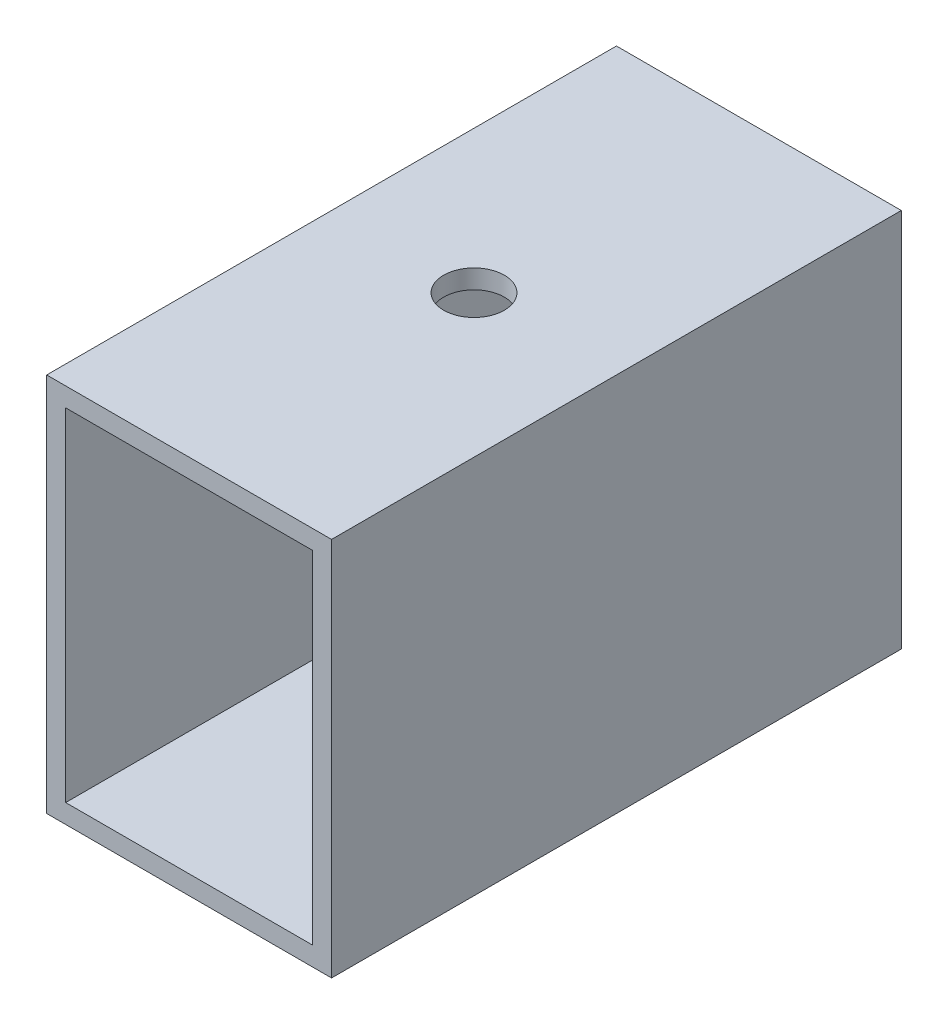
ISO-10303-21;
HEADER;
FILE_DESCRIPTION(('STEP AP214'),'2;1');
FILE_NAME('part.step','',(''),(''),'','','');
FILE_SCHEMA(('AUTOMOTIVE_DESIGN { 1 0 10303 214 1 1 1 1 }'));
ENDSEC;
DATA;
#1=APPLICATION_CONTEXT('core data for automotive mechanical design processes');
#2=APPLICATION_PROTOCOL_DEFINITION('international standard','automotive_design',2000,#1);
#3=PRODUCT_CONTEXT('',#1,'mechanical');
#4=PRODUCT('Part','Part','',(#3));
#5=PRODUCT_RELATED_PRODUCT_CATEGORY('part','',(#4));
#6=PRODUCT_DEFINITION_FORMATION('','',#4);
#7=PRODUCT_DEFINITION_CONTEXT('part definition',#1,'design');
#8=PRODUCT_DEFINITION('design','',#6,#7);
#9=PRODUCT_DEFINITION_SHAPE('','',#8);
#10=(LENGTH_UNIT() NAMED_UNIT(*) SI_UNIT(.MILLI.,.METRE.));
#11=(NAMED_UNIT(*) PLANE_ANGLE_UNIT() SI_UNIT($,.RADIAN.));
#12=(NAMED_UNIT(*) SI_UNIT($,.STERADIAN.) SOLID_ANGLE_UNIT());
#13=UNCERTAINTY_MEASURE_WITH_UNIT(LENGTH_MEASURE(1.E-05),#10,'distance_accuracy_value','');
#14=(GEOMETRIC_REPRESENTATION_CONTEXT(3) GLOBAL_UNCERTAINTY_ASSIGNED_CONTEXT((#13)) GLOBAL_UNIT_ASSIGNED_CONTEXT((#10,
#11,#12)) REPRESENTATION_CONTEXT('',''));
#15=CARTESIAN_POINT('',(0.,0.,0.));
#16=DIRECTION('',(0.,0.,1.));
#17=DIRECTION('',(1.,0.,0.));
#18=AXIS2_PLACEMENT_3D('',#15,#16,#17);
#19=CARTESIAN_POINT('',(0.,0.,30.));
#20=DIRECTION('',(0.,0.,1.));
#21=DIRECTION('',(1.,0.,0.));
#22=AXIS2_PLACEMENT_3D('',#19,#20,#21);
#23=PLANE('',#22);
#24=DIRECTION('',(0.,-1.,0.));
#25=VECTOR('',#24,1.);
#26=CARTESIAN_POINT('',(0.,0.,30.));
#27=LINE('',#26,#25);
#28=CARTESIAN_POINT('',(0.,0.,30.));
#29=VERTEX_POINT('',#28);
#30=CARTESIAN_POINT('',(0.,-20.,30.));
#31=VERTEX_POINT('',#30);
#32=EDGE_CURVE('E169',#29,#31,#27,.T.);
#33=ORIENTED_EDGE('',*,*,#32,.T.);
#34=DIRECTION('',(1.,0.,0.));
#35=VECTOR('',#34,1.);
#36=CARTESIAN_POINT('',(0.,-20.,30.));
#37=LINE('',#36,#35);
#38=CARTESIAN_POINT('',(15.,-20.,30.));
#39=VERTEX_POINT('',#38);
#40=EDGE_CURVE('E172',#31,#39,#37,.T.);
#41=ORIENTED_EDGE('',*,*,#40,.T.);
#42=DIRECTION('',(0.,1.,0.));
#43=VECTOR('',#42,1.);
#44=CARTESIAN_POINT('',(15.,0.,30.));
#45=LINE('',#44,#43);
#46=CARTESIAN_POINT('',(15.,0.,30.));
#47=VERTEX_POINT('',#46);
#48=EDGE_CURVE('E175',#39,#47,#45,.T.);
#49=ORIENTED_EDGE('',*,*,#48,.T.);
#50=DIRECTION('',(-1.,0.,0.));
#51=VECTOR('',#50,1.);
#52=CARTESIAN_POINT('',(0.,0.,30.));
#53=LINE('',#52,#51);
#54=EDGE_CURVE('E177',#47,#29,#53,.T.);
#55=ORIENTED_EDGE('',*,*,#54,.T.);
#56=EDGE_LOOP('',(#33,#41,#49,#55));
#57=FACE_BOUND('',#56,.T.);
#58=DIRECTION('',(1.,0.,0.));
#59=VECTOR('',#58,1.);
#60=CARTESIAN_POINT('',(0.,-19.,30.));
#61=LINE('',#60,#59);
#62=CARTESIAN_POINT('',(1.,-19.,30.));
#63=VERTEX_POINT('',#62);
#64=CARTESIAN_POINT('',(14.,-19.,30.));
#65=VERTEX_POINT('',#64);
#66=EDGE_CURVE('E139',#63,#65,#61,.T.);
#67=ORIENTED_EDGE('',*,*,#66,.F.);
#68=DIRECTION('',(0.,-1.,0.));
#69=VECTOR('',#68,1.);
#70=CARTESIAN_POINT('',(1.,0.,30.));
#71=LINE('',#70,#69);
#72=CARTESIAN_POINT('',(1.,-1.,30.));
#73=VERTEX_POINT('',#72);
#74=EDGE_CURVE('E131',#73,#63,#71,.T.);
#75=ORIENTED_EDGE('',*,*,#74,.F.);
#76=DIRECTION('',(-1.,0.,0.));
#77=VECTOR('',#76,1.);
#78=CARTESIAN_POINT('',(0.,-1.,30.));
#79=LINE('',#78,#77);
#80=CARTESIAN_POINT('',(14.,-1.,30.));
#81=VERTEX_POINT('',#80);
#82=EDGE_CURVE('E153',#81,#73,#79,.T.);
#83=ORIENTED_EDGE('',*,*,#82,.F.);
#84=DIRECTION('',(0.,1.,0.));
#85=VECTOR('',#84,1.);
#86=CARTESIAN_POINT('',(14.,0.,30.));
#87=LINE('',#86,#85);
#88=EDGE_CURVE('E151',#65,#81,#87,.T.);
#89=ORIENTED_EDGE('',*,*,#88,.F.);
#90=EDGE_LOOP('',(#67,#75,#83,#89));
#91=FACE_BOUND('',#90,.T.);
#92=ADVANCED_FACE('F65',(#57,#91),#23,.T.);
#93=CARTESIAN_POINT('',(0.,0.,0.));
#94=DIRECTION('',(0.,0.,1.));
#95=DIRECTION('',(1.,0.,0.));
#96=AXIS2_PLACEMENT_3D('',#93,#94,#95);
#97=PLANE('',#96);
#98=DIRECTION('',(0.,-1.,0.));
#99=VECTOR('',#98,1.);
#100=CARTESIAN_POINT('',(0.,0.,0.));
#101=LINE('',#100,#99);
#102=CARTESIAN_POINT('',(0.,0.,0.));
#103=VERTEX_POINT('',#102);
#104=CARTESIAN_POINT('',(0.,-20.,0.));
#105=VERTEX_POINT('',#104);
#106=EDGE_CURVE('E147',#103,#105,#101,.T.);
#107=ORIENTED_EDGE('',*,*,#106,.F.);
#108=DIRECTION('',(-1.,0.,0.));
#109=VECTOR('',#108,1.);
#110=CARTESIAN_POINT('',(0.,0.,0.));
#111=LINE('',#110,#109);
#112=CARTESIAN_POINT('',(15.,0.,0.));
#113=VERTEX_POINT('',#112);
#114=EDGE_CURVE('E173',#113,#103,#111,.T.);
#115=ORIENTED_EDGE('',*,*,#114,.F.);
#116=DIRECTION('',(0.,1.,0.));
#117=VECTOR('',#116,1.);
#118=CARTESIAN_POINT('',(15.,0.,0.));
#119=LINE('',#118,#117);
#120=CARTESIAN_POINT('',(15.,-20.,0.));
#121=VERTEX_POINT('',#120);
#122=EDGE_CURVE('E184',#121,#113,#119,.T.);
#123=ORIENTED_EDGE('',*,*,#122,.F.);
#124=DIRECTION('',(1.,0.,0.));
#125=VECTOR('',#124,1.);
#126=CARTESIAN_POINT('',(0.,-20.,0.));
#127=LINE('',#126,#125);
#128=EDGE_CURVE('E182',#105,#121,#127,.T.);
#129=ORIENTED_EDGE('',*,*,#128,.F.);
#130=EDGE_LOOP('',(#107,#115,#123,#129));
#131=FACE_BOUND('',#130,.T.);
#132=DIRECTION('',(0.,-1.,0.));
#133=VECTOR('',#132,1.);
#134=CARTESIAN_POINT('',(1.,0.,0.));
#135=LINE('',#134,#133);
#136=CARTESIAN_POINT('',(1.,-1.,0.));
#137=VERTEX_POINT('',#136);
#138=CARTESIAN_POINT('',(1.,-19.,0.));
#139=VERTEX_POINT('',#138);
#140=EDGE_CURVE('E89',#137,#139,#135,.T.);
#141=ORIENTED_EDGE('',*,*,#140,.T.);
#142=DIRECTION('',(1.,0.,0.));
#143=VECTOR('',#142,1.);
#144=CARTESIAN_POINT('',(0.,-19.,0.));
#145=LINE('',#144,#143);
#146=CARTESIAN_POINT('',(14.,-19.,0.));
#147=VERTEX_POINT('',#146);
#148=EDGE_CURVE('E146',#139,#147,#145,.T.);
#149=ORIENTED_EDGE('',*,*,#148,.T.);
#150=DIRECTION('',(0.,1.,0.));
#151=VECTOR('',#150,1.);
#152=CARTESIAN_POINT('',(14.,0.,0.));
#153=LINE('',#152,#151);
#154=CARTESIAN_POINT('',(14.,-1.,0.));
#155=VERTEX_POINT('',#154);
#156=EDGE_CURVE('E161',#147,#155,#153,.T.);
#157=ORIENTED_EDGE('',*,*,#156,.T.);
#158=DIRECTION('',(-1.,0.,0.));
#159=VECTOR('',#158,1.);
#160=CARTESIAN_POINT('',(0.,-1.,0.));
#161=LINE('',#160,#159);
#162=EDGE_CURVE('E140',#155,#137,#161,.T.);
#163=ORIENTED_EDGE('',*,*,#162,.T.);
#164=EDGE_LOOP('',(#141,#149,#157,#163));
#165=FACE_BOUND('',#164,.T.);
#166=ADVANCED_FACE('F203',(#131,#165),#97,.F.);
#167=CARTESIAN_POINT('',(0.,0.,30.));
#168=DIRECTION('',(1.,0.,0.));
#169=DIRECTION('',(0.,1.,0.));
#170=AXIS2_PLACEMENT_3D('',#167,#168,#169);
#171=PLANE('',#170);
#172=ORIENTED_EDGE('',*,*,#106,.T.);
#173=DIRECTION('',(0.,0.,-1.));
#174=VECTOR('',#173,1.);
#175=CARTESIAN_POINT('',(0.,-20.,30.));
#176=LINE('',#175,#174);
#177=EDGE_CURVE('E12',#31,#105,#176,.T.);
#178=ORIENTED_EDGE('',*,*,#177,.F.);
#179=ORIENTED_EDGE('',*,*,#32,.F.);
#180=DIRECTION('',(0.,0.,-1.));
#181=VECTOR('',#180,1.);
#182=CARTESIAN_POINT('',(0.,0.,30.));
#183=LINE('',#182,#181);
#184=EDGE_CURVE('E179',#29,#103,#183,.T.);
#185=ORIENTED_EDGE('',*,*,#184,.T.);
#186=EDGE_LOOP('',(#172,#178,#179,#185));
#187=FACE_BOUND('',#186,.T.);
#188=ADVANCED_FACE('F67',(#187),#171,.F.);
#189=CARTESIAN_POINT('',(0.,-20.,30.));
#190=DIRECTION('',(0.,1.,0.));
#191=DIRECTION('',(0.,0.,1.));
#192=AXIS2_PLACEMENT_3D('',#189,#190,#191);
#193=PLANE('',#192);
#194=CARTESIAN_POINT('',(7.5,-20.,15.));
#195=DIRECTION('',(0.,-1.,0.));
#196=DIRECTION('',(0.,0.,-1.));
#197=AXIS2_PLACEMENT_3D('',#194,#195,#196);
#198=CIRCLE('',#197,1.6);
#199=CARTESIAN_POINT('',(7.5,-20.,13.4));
#200=VERTEX_POINT('',#199);
#201=EDGE_CURVE('E242',#200,#200,#198,.T.);
#202=ORIENTED_EDGE('',*,*,#201,.F.);
#203=EDGE_LOOP('',(#202));
#204=FACE_BOUND('',#203,.T.);
#205=ORIENTED_EDGE('',*,*,#128,.T.);
#206=DIRECTION('',(0.,0.,-1.));
#207=VECTOR('',#206,1.);
#208=CARTESIAN_POINT('',(15.,-20.,30.));
#209=LINE('',#208,#207);
#210=EDGE_CURVE('E74',#39,#121,#209,.T.);
#211=ORIENTED_EDGE('',*,*,#210,.F.);
#212=ORIENTED_EDGE('',*,*,#40,.F.);
#213=ORIENTED_EDGE('',*,*,#177,.T.);
#214=EDGE_LOOP('',(#205,#211,#212,#213));
#215=FACE_BOUND('',#214,.T.);
#216=ADVANCED_FACE('F213',(#204,#215),#193,.F.);
#217=CARTESIAN_POINT('',(15.,0.,30.));
#218=DIRECTION('',(-1.,0.,0.));
#219=DIRECTION('',(0.,-1.,0.));
#220=AXIS2_PLACEMENT_3D('',#217,#218,#219);
#221=PLANE('',#220);
#222=ORIENTED_EDGE('',*,*,#122,.T.);
#223=DIRECTION('',(0.,0.,-1.));
#224=VECTOR('',#223,1.);
#225=CARTESIAN_POINT('',(15.,0.,30.));
#226=LINE('',#225,#224);
#227=EDGE_CURVE('E189',#47,#113,#226,.T.);
#228=ORIENTED_EDGE('',*,*,#227,.F.);
#229=ORIENTED_EDGE('',*,*,#48,.F.);
#230=ORIENTED_EDGE('',*,*,#210,.T.);
#231=EDGE_LOOP('',(#222,#228,#229,#230));
#232=FACE_BOUND('',#231,.T.);
#233=ADVANCED_FACE('F197',(#232),#221,.F.);
#234=CARTESIAN_POINT('',(0.,0.,30.));
#235=DIRECTION('',(0.,-1.,0.));
#236=DIRECTION('',(0.,0.,-1.));
#237=AXIS2_PLACEMENT_3D('',#234,#235,#236);
#238=PLANE('',#237);
#239=CARTESIAN_POINT('',(7.5,0.,15.));
#240=DIRECTION('',(0.,-1.,0.));
#241=DIRECTION('',(0.,0.,-1.));
#242=AXIS2_PLACEMENT_3D('',#239,#240,#241);
#243=CIRCLE('',#242,1.6);
#244=CARTESIAN_POINT('',(7.5,0.,13.4));
#245=VERTEX_POINT('',#244);
#246=EDGE_CURVE('E240',#245,#245,#243,.T.);
#247=ORIENTED_EDGE('',*,*,#246,.T.);
#248=EDGE_LOOP('',(#247));
#249=FACE_BOUND('',#248,.T.);
#250=ORIENTED_EDGE('',*,*,#114,.T.);
#251=ORIENTED_EDGE('',*,*,#184,.F.);
#252=ORIENTED_EDGE('',*,*,#54,.F.);
#253=ORIENTED_EDGE('',*,*,#227,.T.);
#254=EDGE_LOOP('',(#250,#251,#252,#253));
#255=FACE_BOUND('',#254,.T.);
#256=ADVANCED_FACE('F207',(#249,#255),#238,.F.);
#257=CARTESIAN_POINT('',(1.,0.,30.));
#258=DIRECTION('',(1.,0.,0.));
#259=DIRECTION('',(0.,1.,0.));
#260=AXIS2_PLACEMENT_3D('',#257,#258,#259);
#261=PLANE('',#260);
#262=ORIENTED_EDGE('',*,*,#140,.F.);
#263=DIRECTION('',(0.,0.,-1.));
#264=VECTOR('',#263,1.);
#265=CARTESIAN_POINT('',(1.,-1.,30.));
#266=LINE('',#265,#264);
#267=EDGE_CURVE('E135',#73,#137,#266,.T.);
#268=ORIENTED_EDGE('',*,*,#267,.F.);
#269=ORIENTED_EDGE('',*,*,#74,.T.);
#270=DIRECTION('',(0.,0.,-1.));
#271=VECTOR('',#270,1.);
#272=CARTESIAN_POINT('',(1.,-19.,30.));
#273=LINE('',#272,#271);
#274=EDGE_CURVE('E134',#63,#139,#273,.T.);
#275=ORIENTED_EDGE('',*,*,#274,.T.);
#276=EDGE_LOOP('',(#262,#268,#269,#275));
#277=FACE_BOUND('',#276,.T.);
#278=ADVANCED_FACE('F133',(#277),#261,.T.);
#279=CARTESIAN_POINT('',(0.,-19.,30.));
#280=DIRECTION('',(0.,1.,0.));
#281=DIRECTION('',(0.,0.,1.));
#282=AXIS2_PLACEMENT_3D('',#279,#280,#281);
#283=PLANE('',#282);
#284=CARTESIAN_POINT('',(7.5,-19.,15.));
#285=DIRECTION('',(0.,1.,0.));
#286=DIRECTION('',(0.,0.,1.));
#287=AXIS2_PLACEMENT_3D('',#284,#285,#286);
#288=CIRCLE('',#287,1.6);
#289=CARTESIAN_POINT('',(7.5,-19.,16.6));
#290=VERTEX_POINT('',#289);
#291=EDGE_CURVE('E159',#290,#290,#288,.T.);
#292=ORIENTED_EDGE('',*,*,#291,.F.);
#293=EDGE_LOOP('',(#292));
#294=FACE_BOUND('',#293,.T.);
#295=ORIENTED_EDGE('',*,*,#148,.F.);
#296=ORIENTED_EDGE('',*,*,#274,.F.);
#297=ORIENTED_EDGE('',*,*,#66,.T.);
#298=DIRECTION('',(0.,0.,-1.));
#299=VECTOR('',#298,1.);
#300=CARTESIAN_POINT('',(14.,-19.,30.));
#301=LINE('',#300,#299);
#302=EDGE_CURVE('E148',#65,#147,#301,.T.);
#303=ORIENTED_EDGE('',*,*,#302,.T.);
#304=EDGE_LOOP('',(#295,#296,#297,#303));
#305=FACE_BOUND('',#304,.T.);
#306=ADVANCED_FACE('F143',(#294,#305),#283,.T.);
#307=CARTESIAN_POINT('',(14.,0.,30.));
#308=DIRECTION('',(-1.,0.,0.));
#309=DIRECTION('',(0.,-1.,0.));
#310=AXIS2_PLACEMENT_3D('',#307,#308,#309);
#311=PLANE('',#310);
#312=ORIENTED_EDGE('',*,*,#156,.F.);
#313=ORIENTED_EDGE('',*,*,#302,.F.);
#314=ORIENTED_EDGE('',*,*,#88,.T.);
#315=DIRECTION('',(0.,0.,-1.));
#316=VECTOR('',#315,1.);
#317=CARTESIAN_POINT('',(14.,-1.,30.));
#318=LINE('',#317,#316);
#319=EDGE_CURVE('E81',#81,#155,#318,.T.);
#320=ORIENTED_EDGE('',*,*,#319,.T.);
#321=EDGE_LOOP('',(#312,#313,#314,#320));
#322=FACE_BOUND('',#321,.T.);
#323=ADVANCED_FACE('F253',(#322),#311,.T.);
#324=CARTESIAN_POINT('',(0.,-1.,30.));
#325=DIRECTION('',(0.,-1.,0.));
#326=DIRECTION('',(0.,0.,-1.));
#327=AXIS2_PLACEMENT_3D('',#324,#325,#326);
#328=PLANE('',#327);
#329=CARTESIAN_POINT('',(7.5,-1.,15.));
#330=DIRECTION('',(0.,-1.,0.));
#331=DIRECTION('',(0.,0.,-1.));
#332=AXIS2_PLACEMENT_3D('',#329,#330,#331);
#333=CIRCLE('',#332,1.6);
#334=CARTESIAN_POINT('',(7.5,-1.,13.4));
#335=VERTEX_POINT('',#334);
#336=EDGE_CURVE('E69',#335,#335,#333,.T.);
#337=ORIENTED_EDGE('',*,*,#336,.F.);
#338=EDGE_LOOP('',(#337));
#339=FACE_BOUND('',#338,.T.);
#340=ORIENTED_EDGE('',*,*,#162,.F.);
#341=ORIENTED_EDGE('',*,*,#319,.F.);
#342=ORIENTED_EDGE('',*,*,#82,.T.);
#343=ORIENTED_EDGE('',*,*,#267,.T.);
#344=EDGE_LOOP('',(#340,#341,#342,#343));
#345=FACE_BOUND('',#344,.T.);
#346=ADVANCED_FACE('F257',(#339,#345),#328,.T.);
#347=CARTESIAN_POINT('',(7.5,0.,15.));
#348=DIRECTION('',(0.,-1.,0.));
#349=DIRECTION('',(0.,0.,-1.));
#350=AXIS2_PLACEMENT_3D('',#347,#348,#349);
#351=CYLINDRICAL_SURFACE('',#350,1.6);
#352=ORIENTED_EDGE('',*,*,#336,.T.);
#353=EDGE_LOOP('',(#352));
#354=FACE_BOUND('',#353,.T.);
#355=ORIENTED_EDGE('',*,*,#246,.F.);
#356=EDGE_LOOP('',(#355));
#357=FACE_BOUND('',#356,.T.);
#358=ADVANCED_FACE('F262',(#354,#357),#351,.F.);
#359=ORIENTED_EDGE('',*,*,#291,.T.);
#360=EDGE_LOOP('',(#359));
#361=FACE_BOUND('',#360,.T.);
#362=ORIENTED_EDGE('',*,*,#201,.T.);
#363=EDGE_LOOP('',(#362));
#364=FACE_BOUND('',#363,.T.);
#365=ADVANCED_FACE('F250',(#361,#364),#351,.F.);
#366=CLOSED_SHELL('',(#92,#166,#188,#216,#233,#256,#278,#306,#323,#346,#358,#365));
#367=MANIFOLD_SOLID_BREP('B2',#366);
#368=ADVANCED_BREP_SHAPE_REPRESENTATION('',(#18,#367),#14);
#369=SHAPE_DEFINITION_REPRESENTATION(#9,#368);
ENDSEC;
END-ISO-10303-21;
